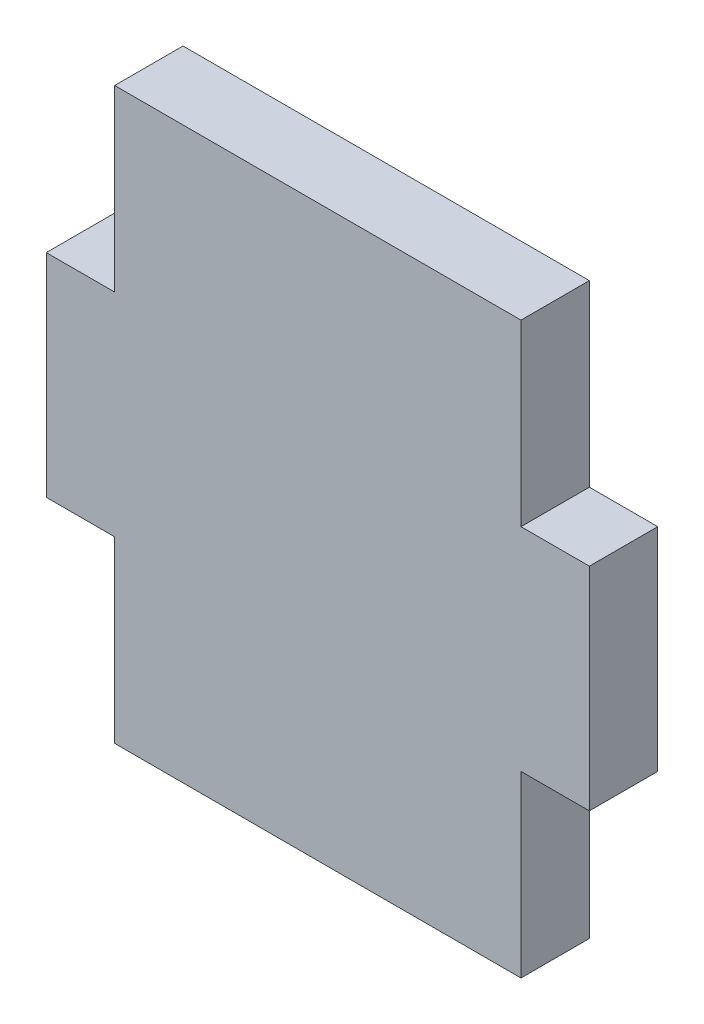
ISO-10303-21;
HEADER;
FILE_DESCRIPTION(('STEP AP214'),'2;1');
FILE_NAME('part.step','',(''),(''),'','','');
FILE_SCHEMA(('AUTOMOTIVE_DESIGN { 1 0 10303 214 1 1 1 1 }'));
ENDSEC;
DATA;
#1=APPLICATION_CONTEXT('core data for automotive mechanical design processes');
#2=APPLICATION_PROTOCOL_DEFINITION('international standard','automotive_design',2000,#1);
#3=PRODUCT_CONTEXT('',#1,'mechanical');
#4=PRODUCT('Part','Part','',(#3));
#5=PRODUCT_RELATED_PRODUCT_CATEGORY('part','',(#4));
#6=PRODUCT_DEFINITION_FORMATION('','',#4);
#7=PRODUCT_DEFINITION_CONTEXT('part definition',#1,'design');
#8=PRODUCT_DEFINITION('design','',#6,#7);
#9=PRODUCT_DEFINITION_SHAPE('','',#8);
#10=(LENGTH_UNIT() NAMED_UNIT(*) SI_UNIT(.MILLI.,.METRE.));
#11=(NAMED_UNIT(*) PLANE_ANGLE_UNIT() SI_UNIT($,.RADIAN.));
#12=(NAMED_UNIT(*) SI_UNIT($,.STERADIAN.) SOLID_ANGLE_UNIT());
#13=UNCERTAINTY_MEASURE_WITH_UNIT(LENGTH_MEASURE(1.E-05),#10,'distance_accuracy_value','');
#14=(GEOMETRIC_REPRESENTATION_CONTEXT(3) GLOBAL_UNCERTAINTY_ASSIGNED_CONTEXT((#13)) GLOBAL_UNIT_ASSIGNED_CONTEXT((#10,
#11,#12)) REPRESENTATION_CONTEXT('',''));
#15=CARTESIAN_POINT('',(0.,0.,0.));
#16=DIRECTION('',(0.,0.,1.));
#17=DIRECTION('',(1.,0.,0.));
#18=AXIS2_PLACEMENT_3D('',#15,#16,#17);
#19=CARTESIAN_POINT('',(9.05716693498512,-14.224,1.524));
#20=DIRECTION('',(0.,1.,0.));
#21=DIRECTION('',(0.,0.,1.));
#22=AXIS2_PLACEMENT_3D('',#19,#20,#21);
#23=PLANE('',#22);
#24=DIRECTION('',(1.,0.,0.));
#25=VECTOR('',#24,1.);
#26=CARTESIAN_POINT('',(9.05716693498512,-14.224,0.));
#27=LINE('',#26,#25);
#28=CARTESIAN_POINT('',(0.,-14.224,0.));
#29=VERTEX_POINT('',#28);
#30=CARTESIAN_POINT('',(9.05716693498512,-14.224,0.));
#31=VERTEX_POINT('',#30);
#32=EDGE_CURVE('E156',#29,#31,#27,.T.);
#33=ORIENTED_EDGE('',*,*,#32,.T.);
#34=DIRECTION('',(0.,0.,-1.));
#35=VECTOR('',#34,1.);
#36=CARTESIAN_POINT('',(9.05716693498512,-14.224,1.524));
#37=LINE('',#36,#35);
#38=CARTESIAN_POINT('',(9.05716693498512,-14.224,1.524));
#39=VERTEX_POINT('',#38);
#40=EDGE_CURVE('E11',#39,#31,#37,.T.);
#41=ORIENTED_EDGE('',*,*,#40,.F.);
#42=DIRECTION('',(1.,0.,0.));
#43=VECTOR('',#42,1.);
#44=CARTESIAN_POINT('',(9.05716693498512,-14.224,1.524));
#45=LINE('',#44,#43);
#46=CARTESIAN_POINT('',(0.,-14.224,1.524));
#47=VERTEX_POINT('',#46);
#48=EDGE_CURVE('E178',#47,#39,#45,.T.);
#49=ORIENTED_EDGE('',*,*,#48,.F.);
#50=DIRECTION('',(0.,0.,-1.));
#51=VECTOR('',#50,1.);
#52=CARTESIAN_POINT('',(0.,-14.224,1.524));
#53=LINE('',#52,#51);
#54=EDGE_CURVE('E152',#47,#29,#53,.T.);
#55=ORIENTED_EDGE('',*,*,#54,.T.);
#56=EDGE_LOOP('',(#33,#41,#49,#55));
#57=FACE_BOUND('',#56,.T.);
#58=ADVANCED_FACE('F36',(#57),#23,.F.);
#59=CARTESIAN_POINT('',(9.05716693498512,-10.2362,1.524));
#60=DIRECTION('',(-1.,0.,0.));
#61=DIRECTION('',(0.,0.,1.));
#62=AXIS2_PLACEMENT_3D('',#59,#60,#61);
#63=PLANE('',#62);
#64=DIRECTION('',(0.,1.,0.));
#65=VECTOR('',#64,1.);
#66=CARTESIAN_POINT('',(9.05716693498512,-10.2362,0.));
#67=LINE('',#66,#65);
#68=CARTESIAN_POINT('',(9.05716693498512,-10.2362,0.));
#69=VERTEX_POINT('',#68);
#70=EDGE_CURVE('E159',#31,#69,#67,.T.);
#71=ORIENTED_EDGE('',*,*,#70,.T.);
#72=DIRECTION('',(0.,0.,-1.));
#73=VECTOR('',#72,1.);
#74=CARTESIAN_POINT('',(9.05716693498512,-10.2362,1.524));
#75=LINE('',#74,#73);
#76=CARTESIAN_POINT('',(9.05716693498512,-10.2362,1.524));
#77=VERTEX_POINT('',#76);
#78=EDGE_CURVE('E44',#77,#69,#75,.T.);
#79=ORIENTED_EDGE('',*,*,#78,.F.);
#80=DIRECTION('',(0.,1.,0.));
#81=VECTOR('',#80,1.);
#82=CARTESIAN_POINT('',(9.05716693498512,-10.2362,1.524));
#83=LINE('',#82,#81);
#84=EDGE_CURVE('E107',#39,#77,#83,.T.);
#85=ORIENTED_EDGE('',*,*,#84,.F.);
#86=ORIENTED_EDGE('',*,*,#40,.T.);
#87=EDGE_LOOP('',(#71,#79,#85,#86));
#88=FACE_BOUND('',#87,.T.);
#89=ADVANCED_FACE('F256',(#88),#63,.F.);
#90=CARTESIAN_POINT('',(10.5811669349851,-10.2362,1.524));
#91=DIRECTION('',(0.,1.,0.));
#92=DIRECTION('',(0.,0.,1.));
#93=AXIS2_PLACEMENT_3D('',#90,#91,#92);
#94=PLANE('',#93);
#95=DIRECTION('',(1.,0.,0.));
#96=VECTOR('',#95,1.);
#97=CARTESIAN_POINT('',(10.5811669349851,-10.2362,0.));
#98=LINE('',#97,#96);
#99=CARTESIAN_POINT('',(10.5811669349851,-10.2362,0.));
#100=VERTEX_POINT('',#99);
#101=EDGE_CURVE('E161',#69,#100,#98,.T.);
#102=ORIENTED_EDGE('',*,*,#101,.T.);
#103=DIRECTION('',(0.,0.,-1.));
#104=VECTOR('',#103,1.);
#105=CARTESIAN_POINT('',(10.5811669349851,-10.2362,1.524));
#106=LINE('',#105,#104);
#107=CARTESIAN_POINT('',(10.5811669349851,-10.2362,1.524));
#108=VERTEX_POINT('',#107);
#109=EDGE_CURVE('E197',#108,#100,#106,.T.);
#110=ORIENTED_EDGE('',*,*,#109,.F.);
#111=DIRECTION('',(1.,0.,0.));
#112=VECTOR('',#111,1.);
#113=CARTESIAN_POINT('',(10.5811669349851,-10.2362,1.524));
#114=LINE('',#113,#112);
#115=EDGE_CURVE('E205',#77,#108,#114,.T.);
#116=ORIENTED_EDGE('',*,*,#115,.F.);
#117=ORIENTED_EDGE('',*,*,#78,.T.);
#118=EDGE_LOOP('',(#102,#110,#116,#117));
#119=FACE_BOUND('',#118,.T.);
#120=ADVANCED_FACE('F203',(#119),#94,.F.);
#121=CARTESIAN_POINT('',(10.5811669349851,-5.5118,1.524));
#122=DIRECTION('',(-1.,0.,0.));
#123=DIRECTION('',(0.,0.,1.));
#124=AXIS2_PLACEMENT_3D('',#121,#122,#123);
#125=PLANE('',#124);
#126=DIRECTION('',(0.,1.,0.));
#127=VECTOR('',#126,1.);
#128=CARTESIAN_POINT('',(10.5811669349851,-5.5118,0.));
#129=LINE('',#128,#127);
#130=CARTESIAN_POINT('',(10.5811669349851,-5.5118,0.));
#131=VERTEX_POINT('',#130);
#132=EDGE_CURVE('E163',#100,#131,#129,.T.);
#133=ORIENTED_EDGE('',*,*,#132,.T.);
#134=DIRECTION('',(0.,0.,-1.));
#135=VECTOR('',#134,1.);
#136=CARTESIAN_POINT('',(10.5811669349851,-5.5118,1.524));
#137=LINE('',#136,#135);
#138=CARTESIAN_POINT('',(10.5811669349851,-5.5118,1.524));
#139=VERTEX_POINT('',#138);
#140=EDGE_CURVE('E194',#139,#131,#137,.T.);
#141=ORIENTED_EDGE('',*,*,#140,.F.);
#142=DIRECTION('',(0.,1.,0.));
#143=VECTOR('',#142,1.);
#144=CARTESIAN_POINT('',(10.5811669349851,-5.5118,1.524));
#145=LINE('',#144,#143);
#146=EDGE_CURVE('E223',#108,#139,#145,.T.);
#147=ORIENTED_EDGE('',*,*,#146,.F.);
#148=ORIENTED_EDGE('',*,*,#109,.T.);
#149=EDGE_LOOP('',(#133,#141,#147,#148));
#150=FACE_BOUND('',#149,.T.);
#151=ADVANCED_FACE('F214',(#150),#125,.F.);
#152=CARTESIAN_POINT('',(9.05716693498512,-5.5118,1.524));
#153=DIRECTION('',(0.,-1.,0.));
#154=DIRECTION('',(0.,0.,-1.));
#155=AXIS2_PLACEMENT_3D('',#152,#153,#154);
#156=PLANE('',#155);
#157=DIRECTION('',(-1.,0.,0.));
#158=VECTOR('',#157,1.);
#159=CARTESIAN_POINT('',(9.05716693498512,-5.5118,0.));
#160=LINE('',#159,#158);
#161=CARTESIAN_POINT('',(9.05716693498512,-5.5118,0.));
#162=VERTEX_POINT('',#161);
#163=EDGE_CURVE('E165',#131,#162,#160,.T.);
#164=ORIENTED_EDGE('',*,*,#163,.T.);
#165=DIRECTION('',(0.,0.,-1.));
#166=VECTOR('',#165,1.);
#167=CARTESIAN_POINT('',(9.05716693498512,-5.5118,1.524));
#168=LINE('',#167,#166);
#169=CARTESIAN_POINT('',(9.05716693498512,-5.5118,1.524));
#170=VERTEX_POINT('',#169);
#171=EDGE_CURVE('E191',#170,#162,#168,.T.);
#172=ORIENTED_EDGE('',*,*,#171,.F.);
#173=DIRECTION('',(-1.,0.,0.));
#174=VECTOR('',#173,1.);
#175=CARTESIAN_POINT('',(9.05716693498512,-5.5118,1.524));
#176=LINE('',#175,#174);
#177=EDGE_CURVE('E220',#139,#170,#176,.T.);
#178=ORIENTED_EDGE('',*,*,#177,.F.);
#179=ORIENTED_EDGE('',*,*,#140,.T.);
#180=EDGE_LOOP('',(#164,#172,#178,#179));
#181=FACE_BOUND('',#180,.T.);
#182=ADVANCED_FACE('F218',(#181),#156,.F.);
#183=CARTESIAN_POINT('',(9.05716693498512,-1.524,1.524));
#184=DIRECTION('',(-1.,0.,0.));
#185=DIRECTION('',(0.,0.,1.));
#186=AXIS2_PLACEMENT_3D('',#183,#184,#185);
#187=PLANE('',#186);
#188=DIRECTION('',(0.,1.,0.));
#189=VECTOR('',#188,1.);
#190=CARTESIAN_POINT('',(9.05716693498512,-1.524,0.));
#191=LINE('',#190,#189);
#192=CARTESIAN_POINT('',(9.05716693498512,-1.524,0.));
#193=VERTEX_POINT('',#192);
#194=EDGE_CURVE('E167',#162,#193,#191,.T.);
#195=ORIENTED_EDGE('',*,*,#194,.T.);
#196=DIRECTION('',(0.,0.,-1.));
#197=VECTOR('',#196,1.);
#198=CARTESIAN_POINT('',(9.05716693498512,-1.524,1.524));
#199=LINE('',#198,#197);
#200=CARTESIAN_POINT('',(9.05716693498512,-1.524,1.524));
#201=VERTEX_POINT('',#200);
#202=EDGE_CURVE('E188',#201,#193,#199,.T.);
#203=ORIENTED_EDGE('',*,*,#202,.F.);
#204=DIRECTION('',(0.,1.,0.));
#205=VECTOR('',#204,1.);
#206=CARTESIAN_POINT('',(9.05716693498512,-1.524,1.524));
#207=LINE('',#206,#205);
#208=EDGE_CURVE('E222',#170,#201,#207,.T.);
#209=ORIENTED_EDGE('',*,*,#208,.F.);
#210=ORIENTED_EDGE('',*,*,#171,.T.);
#211=EDGE_LOOP('',(#195,#203,#209,#210));
#212=FACE_BOUND('',#211,.T.);
#213=ADVANCED_FACE('F269',(#212),#187,.F.);
#214=CARTESIAN_POINT('',(0.,-1.524,1.524));
#215=DIRECTION('',(0.,-1.,0.));
#216=DIRECTION('',(0.,0.,-1.));
#217=AXIS2_PLACEMENT_3D('',#214,#215,#216);
#218=PLANE('',#217);
#219=DIRECTION('',(-1.,0.,0.));
#220=VECTOR('',#219,1.);
#221=CARTESIAN_POINT('',(0.,-1.524,0.));
#222=LINE('',#221,#220);
#223=CARTESIAN_POINT('',(0.,-1.524,0.));
#224=VERTEX_POINT('',#223);
#225=EDGE_CURVE('E169',#193,#224,#222,.T.);
#226=ORIENTED_EDGE('',*,*,#225,.T.);
#227=DIRECTION('',(0.,0.,-1.));
#228=VECTOR('',#227,1.);
#229=CARTESIAN_POINT('',(0.,-1.524,1.524));
#230=LINE('',#229,#228);
#231=CARTESIAN_POINT('',(0.,-1.524,1.524));
#232=VERTEX_POINT('',#231);
#233=EDGE_CURVE('E185',#232,#224,#230,.T.);
#234=ORIENTED_EDGE('',*,*,#233,.F.);
#235=DIRECTION('',(-1.,0.,0.));
#236=VECTOR('',#235,1.);
#237=CARTESIAN_POINT('',(0.,-1.524,1.524));
#238=LINE('',#237,#236);
#239=EDGE_CURVE('E225',#201,#232,#238,.T.);
#240=ORIENTED_EDGE('',*,*,#239,.F.);
#241=ORIENTED_EDGE('',*,*,#202,.T.);
#242=EDGE_LOOP('',(#226,#234,#240,#241));
#243=FACE_BOUND('',#242,.T.);
#244=ADVANCED_FACE('F272',(#243),#218,.F.);
#245=CARTESIAN_POINT('',(0.,-5.5118,1.524));
#246=DIRECTION('',(1.,0.,0.));
#247=DIRECTION('',(0.,0.,-1.));
#248=AXIS2_PLACEMENT_3D('',#245,#246,#247);
#249=PLANE('',#248);
#250=DIRECTION('',(0.,-1.,0.));
#251=VECTOR('',#250,1.);
#252=CARTESIAN_POINT('',(0.,-5.5118,0.));
#253=LINE('',#252,#251);
#254=CARTESIAN_POINT('',(0.,-5.5118,0.));
#255=VERTEX_POINT('',#254);
#256=EDGE_CURVE('E171',#224,#255,#253,.T.);
#257=ORIENTED_EDGE('',*,*,#256,.T.);
#258=DIRECTION('',(0.,0.,-1.));
#259=VECTOR('',#258,1.);
#260=CARTESIAN_POINT('',(0.,-5.5118,1.524));
#261=LINE('',#260,#259);
#262=CARTESIAN_POINT('',(0.,-5.5118,1.524));
#263=VERTEX_POINT('',#262);
#264=EDGE_CURVE('E182',#263,#255,#261,.T.);
#265=ORIENTED_EDGE('',*,*,#264,.F.);
#266=DIRECTION('',(0.,-1.,0.));
#267=VECTOR('',#266,1.);
#268=CARTESIAN_POINT('',(0.,-5.5118,1.524));
#269=LINE('',#268,#267);
#270=EDGE_CURVE('E231',#232,#263,#269,.T.);
#271=ORIENTED_EDGE('',*,*,#270,.F.);
#272=ORIENTED_EDGE('',*,*,#233,.T.);
#273=EDGE_LOOP('',(#257,#265,#271,#272));
#274=FACE_BOUND('',#273,.T.);
#275=ADVANCED_FACE('F237',(#274),#249,.F.);
#276=CARTESIAN_POINT('',(-1.524,-5.5118,1.524));
#277=DIRECTION('',(0.,-1.,0.));
#278=DIRECTION('',(0.,0.,-1.));
#279=AXIS2_PLACEMENT_3D('',#276,#277,#278);
#280=PLANE('',#279);
#281=DIRECTION('',(-1.,0.,0.));
#282=VECTOR('',#281,1.);
#283=CARTESIAN_POINT('',(-1.524,-5.5118,0.));
#284=LINE('',#283,#282);
#285=CARTESIAN_POINT('',(-1.524,-5.5118,0.));
#286=VERTEX_POINT('',#285);
#287=EDGE_CURVE('E173',#255,#286,#284,.T.);
#288=ORIENTED_EDGE('',*,*,#287,.T.);
#289=DIRECTION('',(0.,0.,-1.));
#290=VECTOR('',#289,1.);
#291=CARTESIAN_POINT('',(-1.524,-5.5118,1.524));
#292=LINE('',#291,#290);
#293=CARTESIAN_POINT('',(-1.524,-5.5118,1.524));
#294=VERTEX_POINT('',#293);
#295=EDGE_CURVE('E147',#294,#286,#292,.T.);
#296=ORIENTED_EDGE('',*,*,#295,.F.);
#297=DIRECTION('',(-1.,0.,0.));
#298=VECTOR('',#297,1.);
#299=CARTESIAN_POINT('',(-1.524,-5.5118,1.524));
#300=LINE('',#299,#298);
#301=EDGE_CURVE('E138',#263,#294,#300,.T.);
#302=ORIENTED_EDGE('',*,*,#301,.F.);
#303=ORIENTED_EDGE('',*,*,#264,.T.);
#304=EDGE_LOOP('',(#288,#296,#302,#303));
#305=FACE_BOUND('',#304,.T.);
#306=ADVANCED_FACE('F241',(#305),#280,.F.);
#307=CARTESIAN_POINT('',(-1.524,-10.2362,1.524));
#308=DIRECTION('',(1.,0.,0.));
#309=DIRECTION('',(0.,0.,-1.));
#310=AXIS2_PLACEMENT_3D('',#307,#308,#309);
#311=PLANE('',#310);
#312=DIRECTION('',(0.,-1.,0.));
#313=VECTOR('',#312,1.);
#314=CARTESIAN_POINT('',(-1.524,-10.2362,0.));
#315=LINE('',#314,#313);
#316=CARTESIAN_POINT('',(-1.524,-10.2362,0.));
#317=VERTEX_POINT('',#316);
#318=EDGE_CURVE('E146',#286,#317,#315,.T.);
#319=ORIENTED_EDGE('',*,*,#318,.T.);
#320=DIRECTION('',(0.,0.,-1.));
#321=VECTOR('',#320,1.);
#322=CARTESIAN_POINT('',(-1.524,-10.2362,1.524));
#323=LINE('',#322,#321);
#324=CARTESIAN_POINT('',(-1.524,-10.2362,1.524));
#325=VERTEX_POINT('',#324);
#326=EDGE_CURVE('E143',#325,#317,#323,.T.);
#327=ORIENTED_EDGE('',*,*,#326,.F.);
#328=DIRECTION('',(0.,-1.,0.));
#329=VECTOR('',#328,1.);
#330=CARTESIAN_POINT('',(-1.524,-10.2362,1.524));
#331=LINE('',#330,#329);
#332=EDGE_CURVE('E132',#294,#325,#331,.T.);
#333=ORIENTED_EDGE('',*,*,#332,.F.);
#334=ORIENTED_EDGE('',*,*,#295,.T.);
#335=EDGE_LOOP('',(#319,#327,#333,#334));
#336=FACE_BOUND('',#335,.T.);
#337=ADVANCED_FACE('F144',(#336),#311,.F.);
#338=CARTESIAN_POINT('',(0.,-10.2362,1.524));
#339=DIRECTION('',(0.,1.,0.));
#340=DIRECTION('',(0.,0.,1.));
#341=AXIS2_PLACEMENT_3D('',#338,#339,#340);
#342=PLANE('',#341);
#343=DIRECTION('',(1.,0.,0.));
#344=VECTOR('',#343,1.);
#345=CARTESIAN_POINT('',(0.,-10.2362,0.));
#346=LINE('',#345,#344);
#347=CARTESIAN_POINT('',(0.,-10.2362,0.));
#348=VERTEX_POINT('',#347);
#349=EDGE_CURVE('E93',#317,#348,#346,.T.);
#350=ORIENTED_EDGE('',*,*,#349,.T.);
#351=DIRECTION('',(0.,0.,-1.));
#352=VECTOR('',#351,1.);
#353=CARTESIAN_POINT('',(0.,-10.2362,1.524));
#354=LINE('',#353,#352);
#355=CARTESIAN_POINT('',(0.,-10.2362,1.524));
#356=VERTEX_POINT('',#355);
#357=EDGE_CURVE('E148',#356,#348,#354,.T.);
#358=ORIENTED_EDGE('',*,*,#357,.F.);
#359=DIRECTION('',(1.,0.,0.));
#360=VECTOR('',#359,1.);
#361=CARTESIAN_POINT('',(0.,-10.2362,1.524));
#362=LINE('',#361,#360);
#363=EDGE_CURVE('E136',#325,#356,#362,.T.);
#364=ORIENTED_EDGE('',*,*,#363,.F.);
#365=ORIENTED_EDGE('',*,*,#326,.T.);
#366=EDGE_LOOP('',(#350,#358,#364,#365));
#367=FACE_BOUND('',#366,.T.);
#368=ADVANCED_FACE('F150',(#367),#342,.F.);
#369=CARTESIAN_POINT('',(0.,-14.224,1.524));
#370=DIRECTION('',(1.,0.,0.));
#371=DIRECTION('',(0.,0.,-1.));
#372=AXIS2_PLACEMENT_3D('',#369,#370,#371);
#373=PLANE('',#372);
#374=DIRECTION('',(0.,-1.,0.));
#375=VECTOR('',#374,1.);
#376=CARTESIAN_POINT('',(0.,-14.224,0.));
#377=LINE('',#376,#375);
#378=EDGE_CURVE('E99',#348,#29,#377,.T.);
#379=ORIENTED_EDGE('',*,*,#378,.T.);
#380=ORIENTED_EDGE('',*,*,#54,.F.);
#381=DIRECTION('',(0.,-1.,0.));
#382=VECTOR('',#381,1.);
#383=CARTESIAN_POINT('',(0.,-14.224,1.524));
#384=LINE('',#383,#382);
#385=EDGE_CURVE('E52',#356,#47,#384,.T.);
#386=ORIENTED_EDGE('',*,*,#385,.F.);
#387=ORIENTED_EDGE('',*,*,#357,.T.);
#388=EDGE_LOOP('',(#379,#380,#386,#387));
#389=FACE_BOUND('',#388,.T.);
#390=ADVANCED_FACE('F245',(#389),#373,.F.);
#391=CARTESIAN_POINT('',(0.,0.,1.524));
#392=DIRECTION('',(0.,0.,-1.));
#393=DIRECTION('',(-1.,0.,0.));
#394=AXIS2_PLACEMENT_3D('',#391,#392,#393);
#395=PLANE('',#394);
#396=ORIENTED_EDGE('',*,*,#48,.T.);
#397=ORIENTED_EDGE('',*,*,#84,.T.);
#398=ORIENTED_EDGE('',*,*,#115,.T.);
#399=ORIENTED_EDGE('',*,*,#146,.T.);
#400=ORIENTED_EDGE('',*,*,#177,.T.);
#401=ORIENTED_EDGE('',*,*,#208,.T.);
#402=ORIENTED_EDGE('',*,*,#239,.T.);
#403=ORIENTED_EDGE('',*,*,#270,.T.);
#404=ORIENTED_EDGE('',*,*,#301,.T.);
#405=ORIENTED_EDGE('',*,*,#332,.T.);
#406=ORIENTED_EDGE('',*,*,#363,.T.);
#407=ORIENTED_EDGE('',*,*,#385,.T.);
#408=EDGE_LOOP('',(#396,#397,#398,#399,#400,#401,#402,#403,#404,#405,#406,#407));
#409=FACE_BOUND('',#408,.T.);
#410=ADVANCED_FACE('F134',(#409),#395,.F.);
#411=CARTESIAN_POINT('',(0.,0.,0.));
#412=DIRECTION('',(0.,0.,-1.));
#413=DIRECTION('',(-1.,0.,0.));
#414=AXIS2_PLACEMENT_3D('',#411,#412,#413);
#415=PLANE('',#414);
#416=ORIENTED_EDGE('',*,*,#32,.F.);
#417=ORIENTED_EDGE('',*,*,#378,.F.);
#418=ORIENTED_EDGE('',*,*,#349,.F.);
#419=ORIENTED_EDGE('',*,*,#318,.F.);
#420=ORIENTED_EDGE('',*,*,#287,.F.);
#421=ORIENTED_EDGE('',*,*,#256,.F.);
#422=ORIENTED_EDGE('',*,*,#225,.F.);
#423=ORIENTED_EDGE('',*,*,#194,.F.);
#424=ORIENTED_EDGE('',*,*,#163,.F.);
#425=ORIENTED_EDGE('',*,*,#132,.F.);
#426=ORIENTED_EDGE('',*,*,#101,.F.);
#427=ORIENTED_EDGE('',*,*,#70,.F.);
#428=EDGE_LOOP('',(#416,#417,#418,#419,#420,#421,#422,#423,#424,#425,#426,#427));
#429=FACE_BOUND('',#428,.T.);
#430=ADVANCED_FACE('F209',(#429),#415,.T.);
#431=CLOSED_SHELL('',(#58,#89,#120,#151,#182,#213,#244,#275,#306,#337,#368,#390,#410,#430));
#432=MANIFOLD_SOLID_BREP('B2',#431);
#433=ADVANCED_BREP_SHAPE_REPRESENTATION('',(#18,#432),#14);
#434=SHAPE_DEFINITION_REPRESENTATION(#9,#433);
ENDSEC;
END-ISO-10303-21;
